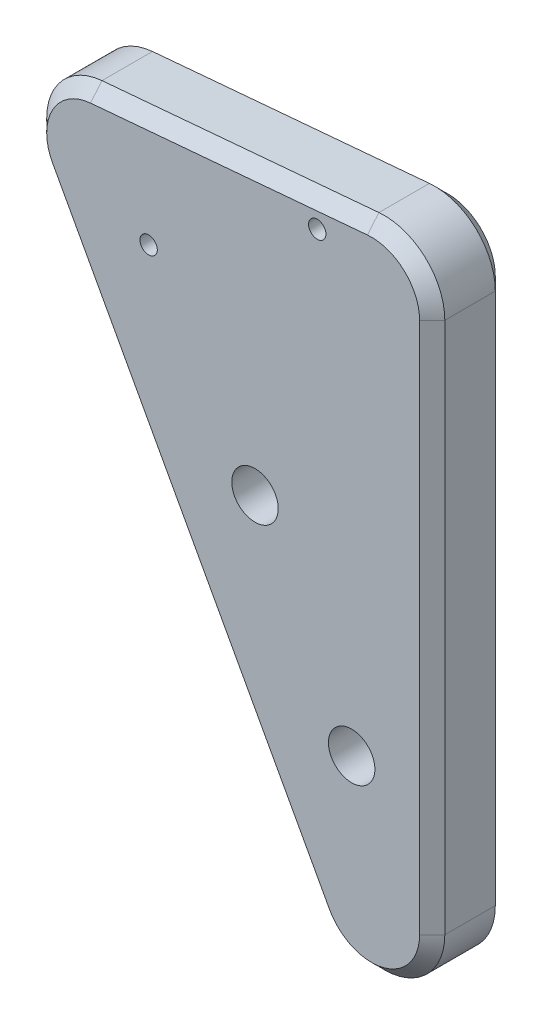
ISO-10303-21;
HEADER;
FILE_DESCRIPTION(('STEP AP214'),'2;1');
FILE_NAME('part.step','',(''),(''),'','','');
FILE_SCHEMA(('AUTOMOTIVE_DESIGN { 1 0 10303 214 1 1 1 1 }'));
ENDSEC;
DATA;
#1=APPLICATION_CONTEXT('core data for automotive mechanical design processes');
#2=APPLICATION_PROTOCOL_DEFINITION('international standard','automotive_design',2000,#1);
#3=PRODUCT_CONTEXT('',#1,'mechanical');
#4=PRODUCT('Part','Part','',(#3));
#5=PRODUCT_RELATED_PRODUCT_CATEGORY('part','',(#4));
#6=PRODUCT_DEFINITION_FORMATION('','',#4);
#7=PRODUCT_DEFINITION_CONTEXT('part definition',#1,'design');
#8=PRODUCT_DEFINITION('design','',#6,#7);
#9=PRODUCT_DEFINITION_SHAPE('','',#8);
#10=(LENGTH_UNIT() NAMED_UNIT(*) SI_UNIT(.MILLI.,.METRE.));
#11=(NAMED_UNIT(*) PLANE_ANGLE_UNIT() SI_UNIT($,.RADIAN.));
#12=(NAMED_UNIT(*) SI_UNIT($,.STERADIAN.) SOLID_ANGLE_UNIT());
#13=UNCERTAINTY_MEASURE_WITH_UNIT(LENGTH_MEASURE(1.E-05),#10,'distance_accuracy_value','');
#14=(GEOMETRIC_REPRESENTATION_CONTEXT(3) GLOBAL_UNCERTAINTY_ASSIGNED_CONTEXT((#13)) GLOBAL_UNIT_ASSIGNED_CONTEXT((#10,
#11,#12)) REPRESENTATION_CONTEXT('',''));
#15=CARTESIAN_POINT('',(0.,0.,0.));
#16=DIRECTION('',(0.,0.,1.));
#17=DIRECTION('',(1.,0.,0.));
#18=AXIS2_PLACEMENT_3D('',#15,#16,#17);
#19=CARTESIAN_POINT('',(0.,0.,9.525));
#20=DIRECTION('',(0.,0.,1.));
#21=DIRECTION('',(1.,0.,0.));
#22=AXIS2_PLACEMENT_3D('',#19,#20,#21);
#23=PLANE('',#22);
#24=DIRECTION('',(0.478691857940602,-0.877982975427984,0.));
#25=VECTOR('',#24,1.);
#26=CARTESIAN_POINT('',(41.7980470633415,-73.3467117631821,9.525));
#27=LINE('',#26,#25);
#28=CARTESIAN_POINT('',(6.96796387748848,-9.46382016464998,9.525));
#29=VERTEX_POINT('',#28);
#30=CARTESIAN_POINT('',(41.7980470633415,-73.3467117631821,9.525));
#31=VERTEX_POINT('',#30);
#32=EDGE_CURVE('E52',#29,#31,#27,.T.);
#33=ORIENTED_EDGE('',*,*,#32,.T.);
#34=CARTESIAN_POINT('',(47.0944793626107,-70.4590031301554,9.525));
#35=DIRECTION('',(0.,0.,1.));
#36=DIRECTION('',(1.,0.,0.));
#37=AXIS2_PLACEMENT_3D('',#34,#35,#36);
#38=CIRCLE('',#37,6.03249999999998);
#39=CARTESIAN_POINT('',(53.1269793626107,-70.4590031301554,9.525));
#40=VERTEX_POINT('',#39);
#41=EDGE_CURVE('E11',#31,#40,#38,.T.);
#42=ORIENTED_EDGE('',*,*,#41,.T.);
#43=DIRECTION('',(0.,1.,0.));
#44=VECTOR('',#43,1.);
#45=CARTESIAN_POINT('',(53.1269793626107,-3.52887410319627,9.525));
#46=LINE('',#45,#44);
#47=CARTESIAN_POINT('',(53.1269793626107,-3.52887410319627,9.525));
#48=VERTEX_POINT('',#47);
#49=EDGE_CURVE('E218',#40,#48,#46,.T.);
#50=ORIENTED_EDGE('',*,*,#49,.T.);
#51=CARTESIAN_POINT('',(47.0944793626107,-3.52887410319627,9.525));
#52=DIRECTION('',(0.,0.,1.));
#53=DIRECTION('',(1.,0.,0.));
#54=AXIS2_PLACEMENT_3D('',#51,#52,#53);
#55=CIRCLE('',#54,6.03249999999998);
#56=CARTESIAN_POINT('',(46.5687123444855,2.48067041304217,9.525));
#57=VERTEX_POINT('',#56);
#58=EDGE_CURVE('E215',#48,#57,#55,.T.);
#59=ORIENTED_EDGE('',*,*,#58,.T.);
#60=DIRECTION('',(-0.996194698091746,-0.0871557427476585,0.));
#61=VECTOR('',#60,1.);
#62=CARTESIAN_POINT('',(11.7386291586325,-0.566567015384878,9.525));
#63=LINE('',#62,#61);
#64=CARTESIAN_POINT('',(11.7386291586325,-0.566567015384878,9.525));
#65=VERTEX_POINT('',#64);
#66=EDGE_CURVE('E212',#57,#65,#63,.T.);
#67=ORIENTED_EDGE('',*,*,#66,.T.);
#68=CARTESIAN_POINT('',(12.2643961767578,-6.57611153162332,9.525));
#69=DIRECTION('',(0.,0.,1.));
#70=DIRECTION('',(1.,0.,0.));
#71=AXIS2_PLACEMENT_3D('',#68,#69,#70);
#72=CIRCLE('',#71,6.03249999999998);
#73=EDGE_CURVE('E63',#65,#29,#72,.T.);
#74=ORIENTED_EDGE('',*,*,#73,.T.);
#75=EDGE_LOOP('',(#33,#42,#50,#59,#67,#74));
#76=FACE_BOUND('',#75,.T.);
#77=CARTESIAN_POINT('',(40.2574839147834,-0.0475098776833559,9.525));
#78=DIRECTION('',(0.,0.,1.));
#79=DIRECTION('',(1.,0.,0.));
#80=AXIS2_PLACEMENT_3D('',#77,#78,#79);
#81=CIRCLE('',#80,1.0922);
#82=CARTESIAN_POINT('',(39.1652839147834,-0.0475098776833559,9.525));
#83=VERTEX_POINT('',#82);
#84=EDGE_CURVE('E304',#83,#83,#81,.T.);
#85=ORIENTED_EDGE('',*,*,#84,.F.);
#86=EDGE_LOOP('',(#85));
#87=FACE_BOUND('',#86,.T.);
#88=CARTESIAN_POINT('',(44.5870100650864,-55.247724237799,9.525));
#89=DIRECTION('',(0.,0.,1.));
#90=DIRECTION('',(1.,0.,0.));
#91=AXIS2_PLACEMENT_3D('',#88,#89,#90);
#92=CIRCLE('',#91,2.921);
#93=CARTESIAN_POINT('',(41.6660100650864,-55.247724237799,9.525));
#94=VERTEX_POINT('',#93);
#95=EDGE_CURVE('E291',#94,#94,#92,.T.);
#96=ORIENTED_EDGE('',*,*,#95,.F.);
#97=EDGE_LOOP('',(#96));
#98=FACE_BOUND('',#97,.T.);
#99=CARTESIAN_POINT('',(32.4282368733951,-32.9469566619282,9.525));
#100=DIRECTION('',(0.,0.,1.));
#101=DIRECTION('',(1.,0.,0.));
#102=AXIS2_PLACEMENT_3D('',#99,#100,#101);
#103=CIRCLE('',#102,2.921);
#104=CARTESIAN_POINT('',(29.5072368733951,-32.9469566619282,9.525));
#105=VERTEX_POINT('',#104);
#106=EDGE_CURVE('E296',#105,#105,#103,.T.);
#107=ORIENTED_EDGE('',*,*,#106,.F.);
#108=EDGE_LOOP('',(#107));
#109=FACE_BOUND('',#108,.T.);
#110=CARTESIAN_POINT('',(19.05,-12.3567040903117,9.525));
#111=DIRECTION('',(0.,0.,1.));
#112=DIRECTION('',(1.,0.,0.));
#113=AXIS2_PLACEMENT_3D('',#110,#111,#112);
#114=CIRCLE('',#113,1.0922);
#115=CARTESIAN_POINT('',(17.9578,-12.3567040903117,9.525));
#116=VERTEX_POINT('',#115);
#117=EDGE_CURVE('E312',#116,#116,#114,.T.);
#118=ORIENTED_EDGE('',*,*,#117,.F.);
#119=EDGE_LOOP('',(#118));
#120=FACE_BOUND('',#119,.T.);
#121=ADVANCED_FACE('F41',(#76,#87,#98,#109,#120),#23,.T.);
#122=CARTESIAN_POINT('',(0.,0.,0.));
#123=DIRECTION('',(0.,0.,1.));
#124=DIRECTION('',(1.,0.,0.));
#125=AXIS2_PLACEMENT_3D('',#122,#123,#124);
#126=PLANE('',#125);
#127=DIRECTION('',(-0.478691857940602,0.877982975427984,0.));
#128=VECTOR('',#127,1.);
#129=CARTESIAN_POINT('',(1.39379797349192,0.759923324480704,0.));
#130=LINE('',#129,#128);
#131=CARTESIAN_POINT('',(41.7980470633414,-73.3467117631821,0.));
#132=VERTEX_POINT('',#131);
#133=CARTESIAN_POINT('',(6.96796387748847,-9.46382016465,0.));
#134=VERTEX_POINT('',#133);
#135=EDGE_CURVE('E260',#132,#134,#130,.T.);
#136=ORIENTED_EDGE('',*,*,#135,.T.);
#137=CARTESIAN_POINT('',(12.2643961767578,-6.57611153162332,0.));
#138=DIRECTION('',(0.,0.,1.));
#139=DIRECTION('',(1.,0.,0.));
#140=AXIS2_PLACEMENT_3D('',#137,#138,#139);
#141=CIRCLE('',#140,6.0325);
#142=CARTESIAN_POINT('',(11.7386291586325,-0.566567015384858,0.));
#143=VERTEX_POINT('',#142);
#144=EDGE_CURVE('E139',#134,#143,#141,.F.);
#145=ORIENTED_EDGE('',*,*,#144,.T.);
#146=DIRECTION('',(0.996194698091746,0.0871557427476585,0.));
#147=VECTOR('',#146,1.);
#148=CARTESIAN_POINT('',(0.138359741611908,-1.58145908322065,0.));
#149=LINE('',#148,#147);
#150=CARTESIAN_POINT('',(46.5687123444855,2.48067041304219,0.));
#151=VERTEX_POINT('',#150);
#152=EDGE_CURVE('E132',#143,#151,#149,.T.);
#153=ORIENTED_EDGE('',*,*,#152,.T.);
#154=CARTESIAN_POINT('',(47.0944793626107,-3.52887410319627,0.));
#155=DIRECTION('',(0.,0.,1.));
#156=DIRECTION('',(1.,0.,0.));
#157=AXIS2_PLACEMENT_3D('',#154,#155,#156);
#158=CIRCLE('',#157,6.0325);
#159=CARTESIAN_POINT('',(53.1269793626107,-3.52887410319627,0.));
#160=VERTEX_POINT('',#159);
#161=EDGE_CURVE('E136',#151,#160,#158,.F.);
#162=ORIENTED_EDGE('',*,*,#161,.T.);
#163=DIRECTION('',(0.,-1.,0.));
#164=VECTOR('',#163,1.);
#165=CARTESIAN_POINT('',(53.1269793626107,0.,0.));
#166=LINE('',#165,#164);
#167=CARTESIAN_POINT('',(53.1269793626107,-70.4590031301554,0.));
#168=VERTEX_POINT('',#167);
#169=EDGE_CURVE('E144',#160,#168,#166,.T.);
#170=ORIENTED_EDGE('',*,*,#169,.T.);
#171=CARTESIAN_POINT('',(47.0944793626107,-70.4590031301554,0.));
#172=DIRECTION('',(0.,0.,1.));
#173=DIRECTION('',(1.,0.,0.));
#174=AXIS2_PLACEMENT_3D('',#171,#172,#173);
#175=CIRCLE('',#174,6.0325);
#176=EDGE_CURVE('E263',#168,#132,#175,.F.);
#177=ORIENTED_EDGE('',*,*,#176,.T.);
#178=EDGE_LOOP('',(#136,#145,#153,#162,#170,#177));
#179=FACE_BOUND('',#178,.T.);
#180=CARTESIAN_POINT('',(44.5870100650864,-55.247724237799,0.));
#181=DIRECTION('',(0.,0.,1.));
#182=DIRECTION('',(1.,0.,0.));
#183=AXIS2_PLACEMENT_3D('',#180,#181,#182);
#184=CIRCLE('',#183,2.921);
#185=CARTESIAN_POINT('',(41.6660100650864,-55.247724237799,0.));
#186=VERTEX_POINT('',#185);
#187=EDGE_CURVE('E292',#186,#186,#184,.T.);
#188=ORIENTED_EDGE('',*,*,#187,.T.);
#189=EDGE_LOOP('',(#188));
#190=FACE_BOUND('',#189,.T.);
#191=CARTESIAN_POINT('',(32.4282368733951,-32.9469566619282,0.));
#192=DIRECTION('',(0.,0.,1.));
#193=DIRECTION('',(1.,0.,0.));
#194=AXIS2_PLACEMENT_3D('',#191,#192,#193);
#195=CIRCLE('',#194,2.921);
#196=CARTESIAN_POINT('',(29.5072368733951,-32.9469566619282,0.));
#197=VERTEX_POINT('',#196);
#198=EDGE_CURVE('E300',#197,#197,#195,.T.);
#199=ORIENTED_EDGE('',*,*,#198,.T.);
#200=EDGE_LOOP('',(#199));
#201=FACE_BOUND('',#200,.T.);
#202=CARTESIAN_POINT('',(40.2574839147834,-0.0475098776833559,0.));
#203=DIRECTION('',(0.,0.,1.));
#204=DIRECTION('',(1.,0.,0.));
#205=AXIS2_PLACEMENT_3D('',#202,#203,#204);
#206=CIRCLE('',#205,1.0922);
#207=CARTESIAN_POINT('',(39.1652839147834,-0.0475098776833559,0.));
#208=VERTEX_POINT('',#207);
#209=EDGE_CURVE('E308',#208,#208,#206,.T.);
#210=ORIENTED_EDGE('',*,*,#209,.T.);
#211=EDGE_LOOP('',(#210));
#212=FACE_BOUND('',#211,.T.);
#213=CARTESIAN_POINT('',(19.05,-12.3567040903117,0.));
#214=DIRECTION('',(0.,0.,1.));
#215=DIRECTION('',(1.,0.,0.));
#216=AXIS2_PLACEMENT_3D('',#213,#214,#215);
#217=CIRCLE('',#216,1.0922);
#218=CARTESIAN_POINT('',(17.9578,-12.3567040903117,0.));
#219=VERTEX_POINT('',#218);
#220=EDGE_CURVE('E178',#219,#219,#217,.T.);
#221=ORIENTED_EDGE('',*,*,#220,.T.);
#222=EDGE_LOOP('',(#221));
#223=FACE_BOUND('',#222,.T.);
#224=ADVANCED_FACE('F134',(#179,#190,#201,#212,#223),#126,.F.);
#225=CARTESIAN_POINT('',(0.,0.,9.525));
#226=DIRECTION('',(0.0871557427476584,-0.996194698091745,0.));
#227=DIRECTION('',(0.996194698091746,0.0871557427476585,0.));
#228=AXIS2_PLACEMENT_3D('',#225,#226,#227);
#229=PLANE('',#228);
#230=DIRECTION('',(0.,0.,-1.));
#231=VECTOR('',#230,1.);
#232=CARTESIAN_POINT('',(46.4303526028736,4.06212949626283,9.525));
#233=LINE('',#232,#231);
#234=CARTESIAN_POINT('',(46.4303526028736,4.06212949626283,7.93749999999997));
#235=VERTEX_POINT('',#234);
#236=CARTESIAN_POINT('',(46.4303526028736,4.06212949626283,1.58749999999999));
#237=VERTEX_POINT('',#236);
#238=EDGE_CURVE('E271',#235,#237,#233,.T.);
#239=ORIENTED_EDGE('',*,*,#238,.T.);
#240=DIRECTION('',(-0.996194698091746,-0.0871557427476585,0.));
#241=VECTOR('',#240,1.);
#242=CARTESIAN_POINT('',(0.,0.,1.58749999999999));
#243=LINE('',#242,#241);
#244=CARTESIAN_POINT('',(11.6002694170206,1.01489206783579,1.58749999999999));
#245=VERTEX_POINT('',#244);
#246=EDGE_CURVE('E159',#237,#245,#243,.T.);
#247=ORIENTED_EDGE('',*,*,#246,.T.);
#248=DIRECTION('',(0.,0.,-1.));
#249=VECTOR('',#248,1.);
#250=CARTESIAN_POINT('',(11.6002694170206,1.01489206783579,9.525));
#251=LINE('',#250,#249);
#252=CARTESIAN_POINT('',(11.6002694170206,1.01489206783579,7.93749999999997));
#253=VERTEX_POINT('',#252);
#254=EDGE_CURVE('E156',#245,#253,#251,.F.);
#255=ORIENTED_EDGE('',*,*,#254,.T.);
#256=DIRECTION('',(0.996194698091746,0.0871557427476585,0.));
#257=VECTOR('',#256,1.);
#258=CARTESIAN_POINT('',(46.4303526028736,4.06212949626283,7.93749999999997));
#259=LINE('',#258,#257);
#260=EDGE_CURVE('E229',#253,#235,#259,.T.);
#261=ORIENTED_EDGE('',*,*,#260,.T.);
#262=EDGE_LOOP('',(#239,#247,#255,#261));
#263=FACE_BOUND('',#262,.T.);
#264=ADVANCED_FACE('F331',(#263),#229,.F.);
#265=CARTESIAN_POINT('',(0.,0.,9.525));
#266=DIRECTION('',(0.877982975427983,0.478691857940601,0.));
#267=DIRECTION('',(-0.478691857940602,0.877982975427984,0.));
#268=AXIS2_PLACEMENT_3D('',#265,#266,#267);
#269=PLANE('',#268);
#270=DIRECTION('',(0.,0.,-1.));
#271=VECTOR('',#270,1.);
#272=CARTESIAN_POINT('',(5.57416590399654,-10.2237434891307,9.525));
#273=LINE('',#272,#271);
#274=CARTESIAN_POINT('',(5.57416590399654,-10.2237434891307,7.93749999999997));
#275=VERTEX_POINT('',#274);
#276=CARTESIAN_POINT('',(5.57416590399654,-10.2237434891307,1.58749999999998));
#277=VERTEX_POINT('',#276);
#278=EDGE_CURVE('E279',#275,#277,#273,.T.);
#279=ORIENTED_EDGE('',*,*,#278,.T.);
#280=DIRECTION('',(0.478691857940602,-0.877982975427984,0.));
#281=VECTOR('',#280,1.);
#282=CARTESIAN_POINT('',(0.,0.,1.58749999999998));
#283=LINE('',#282,#281);
#284=CARTESIAN_POINT('',(40.4042490898495,-74.1066350876628,1.58749999999999));
#285=VERTEX_POINT('',#284);
#286=EDGE_CURVE('E245',#277,#285,#283,.T.);
#287=ORIENTED_EDGE('',*,*,#286,.T.);
#288=DIRECTION('',(0.,0.,-1.));
#289=VECTOR('',#288,1.);
#290=CARTESIAN_POINT('',(40.4042490898495,-74.1066350876628,9.525));
#291=LINE('',#290,#289);
#292=CARTESIAN_POINT('',(40.4042490898495,-74.1066350876628,7.93749999999997));
#293=VERTEX_POINT('',#292);
#294=EDGE_CURVE('E275',#285,#293,#291,.F.);
#295=ORIENTED_EDGE('',*,*,#294,.T.);
#296=DIRECTION('',(-0.478691857940602,0.877982975427984,0.));
#297=VECTOR('',#296,1.);
#298=CARTESIAN_POINT('',(5.57416590399655,-10.2237434891307,7.93749999999997));
#299=LINE('',#298,#297);
#300=EDGE_CURVE('E248',#293,#275,#299,.T.);
#301=ORIENTED_EDGE('',*,*,#300,.T.);
#302=EDGE_LOOP('',(#279,#287,#295,#301));
#303=FACE_BOUND('',#302,.T.);
#304=ADVANCED_FACE('F341',(#303),#269,.F.);
#305=CARTESIAN_POINT('',(54.7144793626107,-100.353454091419,9.525));
#306=DIRECTION('',(-1.,0.,0.));
#307=DIRECTION('',(0.,0.,1.));
#308=AXIS2_PLACEMENT_3D('',#305,#306,#307);
#309=PLANE('',#308);
#310=DIRECTION('',(0.,0.,-1.));
#311=VECTOR('',#310,1.);
#312=CARTESIAN_POINT('',(54.7144793626107,-70.4590031301554,9.525));
#313=LINE('',#312,#311);
#314=CARTESIAN_POINT('',(54.7144793626107,-70.4590031301554,7.93749999999997));
#315=VERTEX_POINT('',#314);
#316=CARTESIAN_POINT('',(54.7144793626107,-70.4590031301554,1.58749999999999));
#317=VERTEX_POINT('',#316);
#318=EDGE_CURVE('E283',#315,#317,#313,.T.);
#319=ORIENTED_EDGE('',*,*,#318,.T.);
#320=DIRECTION('',(0.,1.,0.));
#321=VECTOR('',#320,1.);
#322=CARTESIAN_POINT('',(54.7144793626107,-100.353454091419,1.58749999999999));
#323=LINE('',#322,#321);
#324=CARTESIAN_POINT('',(54.7144793626107,-3.52887410319627,1.58749999999999));
#325=VERTEX_POINT('',#324);
#326=EDGE_CURVE('E232',#317,#325,#323,.T.);
#327=ORIENTED_EDGE('',*,*,#326,.T.);
#328=DIRECTION('',(0.,0.,-1.));
#329=VECTOR('',#328,1.);
#330=CARTESIAN_POINT('',(54.7144793626107,-3.52887410319627,9.525));
#331=LINE('',#330,#329);
#332=CARTESIAN_POINT('',(54.7144793626107,-3.52887410319627,7.93749999999997));
#333=VERTEX_POINT('',#332);
#334=EDGE_CURVE('E287',#325,#333,#331,.F.);
#335=ORIENTED_EDGE('',*,*,#334,.T.);
#336=DIRECTION('',(0.,-1.,0.));
#337=VECTOR('',#336,1.);
#338=CARTESIAN_POINT('',(54.7144793626107,-70.4590031301554,7.93749999999997));
#339=LINE('',#338,#337);
#340=EDGE_CURVE('E235',#333,#315,#339,.T.);
#341=ORIENTED_EDGE('',*,*,#340,.T.);
#342=EDGE_LOOP('',(#319,#327,#335,#341));
#343=FACE_BOUND('',#342,.T.);
#344=ADVANCED_FACE('F338',(#343),#309,.F.);
#345=CARTESIAN_POINT('',(44.5870100650864,-55.247724237799,9.525));
#346=DIRECTION('',(0.,0.,-1.));
#347=DIRECTION('',(-1.,0.,0.));
#348=AXIS2_PLACEMENT_3D('',#345,#346,#347);
#349=CYLINDRICAL_SURFACE('',#348,2.921);
#350=CARTESIAN_POINT('',(41.6660100650864,-55.247724237799,9.525));
#351=CARTESIAN_POINT('',(41.6660100650864,-55.247724237799,9.42578125));
#352=CARTESIAN_POINT('',(41.6660100650864,-55.247724237799,9.3265625));
#353=CARTESIAN_POINT('',(41.6660100650864,-55.247724237799,9.128125));
#354=CARTESIAN_POINT('',(41.6660100650864,-55.247724237799,9.02890625));
#355=CARTESIAN_POINT('',(41.6660100650864,-55.247724237799,8.83046875));
#356=CARTESIAN_POINT('',(41.6660100650864,-55.247724237799,8.73125));
#357=CARTESIAN_POINT('',(41.6660100650864,-55.247724237799,8.5328125));
#358=CARTESIAN_POINT('',(41.6660100650864,-55.247724237799,8.43359375));
#359=CARTESIAN_POINT('',(41.6660100650864,-55.247724237799,8.23515625));
#360=CARTESIAN_POINT('',(41.6660100650864,-55.247724237799,8.1359375));
#361=CARTESIAN_POINT('',(41.6660100650864,-55.247724237799,7.9375));
#362=CARTESIAN_POINT('',(41.6660100650864,-55.247724237799,7.83828125));
#363=CARTESIAN_POINT('',(41.6660100650864,-55.247724237799,7.63984375));
#364=CARTESIAN_POINT('',(41.6660100650864,-55.247724237799,7.540625));
#365=CARTESIAN_POINT('',(41.6660100650864,-55.247724237799,7.3421875));
#366=CARTESIAN_POINT('',(41.6660100650864,-55.247724237799,7.24296875));
#367=CARTESIAN_POINT('',(41.6660100650864,-55.247724237799,7.04453125));
#368=CARTESIAN_POINT('',(41.6660100650864,-55.247724237799,6.9453125));
#369=CARTESIAN_POINT('',(41.6660100650864,-55.247724237799,6.746875));
#370=CARTESIAN_POINT('',(41.6660100650864,-55.247724237799,6.64765625));
#371=CARTESIAN_POINT('',(41.6660100650864,-55.247724237799,6.44921875));
#372=CARTESIAN_POINT('',(41.6660100650864,-55.247724237799,6.35));
#373=CARTESIAN_POINT('',(41.6660100650864,-55.247724237799,6.1515625));
#374=CARTESIAN_POINT('',(41.6660100650864,-55.247724237799,6.05234375));
#375=CARTESIAN_POINT('',(41.6660100650864,-55.247724237799,5.85390625));
#376=CARTESIAN_POINT('',(41.6660100650864,-55.247724237799,5.7546875));
#377=CARTESIAN_POINT('',(41.6660100650864,-55.247724237799,5.55625));
#378=CARTESIAN_POINT('',(41.6660100650864,-55.247724237799,5.45703125));
#379=CARTESIAN_POINT('',(41.6660100650864,-55.247724237799,5.25859375));
#380=CARTESIAN_POINT('',(41.6660100650864,-55.247724237799,5.159375));
#381=CARTESIAN_POINT('',(41.6660100650864,-55.247724237799,4.9609375));
#382=CARTESIAN_POINT('',(41.6660100650864,-55.247724237799,4.86171875));
#383=CARTESIAN_POINT('',(41.6660100650864,-55.247724237799,4.66328125));
#384=CARTESIAN_POINT('',(41.6660100650864,-55.247724237799,4.5640625));
#385=CARTESIAN_POINT('',(41.6660100650864,-55.247724237799,4.365625));
#386=CARTESIAN_POINT('',(41.6660100650864,-55.247724237799,4.26640625));
#387=CARTESIAN_POINT('',(41.6660100650864,-55.247724237799,4.06796875));
#388=CARTESIAN_POINT('',(41.6660100650864,-55.247724237799,3.96875));
#389=CARTESIAN_POINT('',(41.6660100650864,-55.247724237799,3.7703125));
#390=CARTESIAN_POINT('',(41.6660100650864,-55.247724237799,3.67109375));
#391=CARTESIAN_POINT('',(41.6660100650864,-55.247724237799,3.47265625));
#392=CARTESIAN_POINT('',(41.6660100650864,-55.247724237799,3.3734375));
#393=CARTESIAN_POINT('',(41.6660100650864,-55.247724237799,3.175));
#394=CARTESIAN_POINT('',(41.6660100650864,-55.247724237799,3.07578125));
#395=CARTESIAN_POINT('',(41.6660100650864,-55.247724237799,2.87734375));
#396=CARTESIAN_POINT('',(41.6660100650864,-55.247724237799,2.778125));
#397=CARTESIAN_POINT('',(41.6660100650864,-55.247724237799,2.5796875));
#398=CARTESIAN_POINT('',(41.6660100650864,-55.247724237799,2.48046875));
#399=CARTESIAN_POINT('',(41.6660100650864,-55.247724237799,2.28203125));
#400=CARTESIAN_POINT('',(41.6660100650864,-55.247724237799,2.1828125));
#401=CARTESIAN_POINT('',(41.6660100650864,-55.247724237799,1.984375));
#402=CARTESIAN_POINT('',(41.6660100650864,-55.247724237799,1.88515625));
#403=CARTESIAN_POINT('',(41.6660100650864,-55.247724237799,1.68671875));
#404=CARTESIAN_POINT('',(41.6660100650864,-55.247724237799,1.5875));
#405=CARTESIAN_POINT('',(41.6660100650864,-55.247724237799,1.3890625));
#406=CARTESIAN_POINT('',(41.6660100650864,-55.247724237799,1.28984375));
#407=CARTESIAN_POINT('',(41.6660100650864,-55.247724237799,1.09140625));
#408=CARTESIAN_POINT('',(41.6660100650864,-55.247724237799,0.992187500000001));
#409=CARTESIAN_POINT('',(41.6660100650864,-55.247724237799,0.793750000000001));
#410=CARTESIAN_POINT('',(41.6660100650864,-55.247724237799,0.69453125));
#411=CARTESIAN_POINT('',(41.6660100650864,-55.247724237799,0.49609375));
#412=CARTESIAN_POINT('',(41.6660100650864,-55.247724237799,0.396875));
#413=CARTESIAN_POINT('',(41.6660100650864,-55.247724237799,0.1984375));
#414=CARTESIAN_POINT('',(41.6660100650864,-55.247724237799,0.0992187500000001));
#415=CARTESIAN_POINT('',(41.6660100650864,-55.247724237799,0.));
#416=B_SPLINE_CURVE_WITH_KNOTS('',3,(#350,#351,#352,#353,#354,#355,#356,#357,#358,#359,#360,
#361,#362,#363,#364,#365,#366,#367,#368,#369,#370,#371,#372,#373,#374,#375,#376,#377,#378,#379,
#380,#381,#382,#383,#384,#385,#386,#387,#388,#389,#390,#391,#392,#393,#394,#395,#396,#397,#398,
#399,#400,#401,#402,#403,#404,#405,#406,#407,#408,#409,#410,#411,#412,#413,#414,#415),
.UNSPECIFIED.,.F.,.F.,(4,2,2,2,2,2,2,2,2,2,2,2,2,2,2,2,2,2,2,2,2,2,2,2,2,2,2,2,2,2,2,2,4),(0.,
0.297656249999998,0.595312499999999,0.892968749999999,1.190625,1.48828125,1.7859375,2.08359375,
2.38125,2.67890625,2.9765625,3.27421875,3.571875,3.86953125,4.1671875,4.46484375,4.7625,
5.06015625,5.3578125,5.65546875,5.953125,6.25078125,6.5484375,6.84609375,7.14375,7.44140625,
7.7390625,8.03671875,8.334375,8.63203125,8.9296875,9.22734375,9.525),.UNSPECIFIED.);
#417=EDGE_CURVE('BSEAM335',#94,#186,#416,.T.);
#418=ORIENTED_EDGE('',*,*,#95,.T.);
#419=ORIENTED_EDGE('',*,*,#187,.F.);
#420=ORIENTED_EDGE('',*,*,#417,.T.);
#421=ORIENTED_EDGE('',*,*,#417,.F.);
#422=EDGE_LOOP('',(#418,#420,#419,#421));
#423=FACE_BOUND('',#422,.T.);
#424=ADVANCED_FACE('F335',(#423),#349,.F.);
#425=CARTESIAN_POINT('',(32.4282368733951,-32.9469566619282,9.525));
#426=DIRECTION('',(0.,0.,-1.));
#427=DIRECTION('',(-1.,0.,0.));
#428=AXIS2_PLACEMENT_3D('',#425,#426,#427);
#429=CYLINDRICAL_SURFACE('',#428,2.921);
#430=CARTESIAN_POINT('',(29.5072368733951,-32.9469566619282,9.525));
#431=CARTESIAN_POINT('',(29.5072368733951,-32.9469566619282,9.42578125));
#432=CARTESIAN_POINT('',(29.5072368733951,-32.9469566619282,9.3265625));
#433=CARTESIAN_POINT('',(29.5072368733951,-32.9469566619282,9.128125));
#434=CARTESIAN_POINT('',(29.5072368733951,-32.9469566619282,9.02890625));
#435=CARTESIAN_POINT('',(29.5072368733951,-32.9469566619282,8.83046875));
#436=CARTESIAN_POINT('',(29.5072368733951,-32.9469566619282,8.73125));
#437=CARTESIAN_POINT('',(29.5072368733951,-32.9469566619282,8.5328125));
#438=CARTESIAN_POINT('',(29.5072368733951,-32.9469566619282,8.43359375));
#439=CARTESIAN_POINT('',(29.5072368733951,-32.9469566619282,8.23515625));
#440=CARTESIAN_POINT('',(29.5072368733951,-32.9469566619282,8.1359375));
#441=CARTESIAN_POINT('',(29.5072368733951,-32.9469566619282,7.9375));
#442=CARTESIAN_POINT('',(29.5072368733951,-32.9469566619282,7.83828125));
#443=CARTESIAN_POINT('',(29.5072368733951,-32.9469566619282,7.63984375));
#444=CARTESIAN_POINT('',(29.5072368733951,-32.9469566619282,7.540625));
#445=CARTESIAN_POINT('',(29.5072368733951,-32.9469566619282,7.3421875));
#446=CARTESIAN_POINT('',(29.5072368733951,-32.9469566619282,7.24296875));
#447=CARTESIAN_POINT('',(29.5072368733951,-32.9469566619282,7.04453125));
#448=CARTESIAN_POINT('',(29.5072368733951,-32.9469566619282,6.9453125));
#449=CARTESIAN_POINT('',(29.5072368733951,-32.9469566619282,6.746875));
#450=CARTESIAN_POINT('',(29.5072368733951,-32.9469566619282,6.64765625));
#451=CARTESIAN_POINT('',(29.5072368733951,-32.9469566619282,6.44921875));
#452=CARTESIAN_POINT('',(29.5072368733951,-32.9469566619282,6.35));
#453=CARTESIAN_POINT('',(29.5072368733951,-32.9469566619282,6.1515625));
#454=CARTESIAN_POINT('',(29.5072368733951,-32.9469566619282,6.05234375));
#455=CARTESIAN_POINT('',(29.5072368733951,-32.9469566619282,5.85390625));
#456=CARTESIAN_POINT('',(29.5072368733951,-32.9469566619282,5.7546875));
#457=CARTESIAN_POINT('',(29.5072368733951,-32.9469566619282,5.55625));
#458=CARTESIAN_POINT('',(29.5072368733951,-32.9469566619282,5.45703125));
#459=CARTESIAN_POINT('',(29.5072368733951,-32.9469566619282,5.25859375));
#460=CARTESIAN_POINT('',(29.5072368733951,-32.9469566619282,5.159375));
#461=CARTESIAN_POINT('',(29.5072368733951,-32.9469566619282,4.9609375));
#462=CARTESIAN_POINT('',(29.5072368733951,-32.9469566619282,4.86171875));
#463=CARTESIAN_POINT('',(29.5072368733951,-32.9469566619282,4.66328125));
#464=CARTESIAN_POINT('',(29.5072368733951,-32.9469566619282,4.5640625));
#465=CARTESIAN_POINT('',(29.5072368733951,-32.9469566619282,4.365625));
#466=CARTESIAN_POINT('',(29.5072368733951,-32.9469566619282,4.26640625));
#467=CARTESIAN_POINT('',(29.5072368733951,-32.9469566619282,4.06796875));
#468=CARTESIAN_POINT('',(29.5072368733951,-32.9469566619282,3.96875));
#469=CARTESIAN_POINT('',(29.5072368733951,-32.9469566619282,3.7703125));
#470=CARTESIAN_POINT('',(29.5072368733951,-32.9469566619282,3.67109375));
#471=CARTESIAN_POINT('',(29.5072368733951,-32.9469566619282,3.47265625));
#472=CARTESIAN_POINT('',(29.5072368733951,-32.9469566619282,3.3734375));
#473=CARTESIAN_POINT('',(29.5072368733951,-32.9469566619282,3.175));
#474=CARTESIAN_POINT('',(29.5072368733951,-32.9469566619282,3.07578125));
#475=CARTESIAN_POINT('',(29.5072368733951,-32.9469566619282,2.87734375));
#476=CARTESIAN_POINT('',(29.5072368733951,-32.9469566619282,2.778125));
#477=CARTESIAN_POINT('',(29.5072368733951,-32.9469566619282,2.5796875));
#478=CARTESIAN_POINT('',(29.5072368733951,-32.9469566619282,2.48046875));
#479=CARTESIAN_POINT('',(29.5072368733951,-32.9469566619282,2.28203125));
#480=CARTESIAN_POINT('',(29.5072368733951,-32.9469566619282,2.1828125));
#481=CARTESIAN_POINT('',(29.5072368733951,-32.9469566619282,1.984375));
#482=CARTESIAN_POINT('',(29.5072368733951,-32.9469566619282,1.88515625));
#483=CARTESIAN_POINT('',(29.5072368733951,-32.9469566619282,1.68671875));
#484=CARTESIAN_POINT('',(29.5072368733951,-32.9469566619282,1.5875));
#485=CARTESIAN_POINT('',(29.5072368733951,-32.9469566619282,1.3890625));
#486=CARTESIAN_POINT('',(29.5072368733951,-32.9469566619282,1.28984375));
#487=CARTESIAN_POINT('',(29.5072368733951,-32.9469566619282,1.09140625));
#488=CARTESIAN_POINT('',(29.5072368733951,-32.9469566619282,0.992187500000001));
#489=CARTESIAN_POINT('',(29.5072368733951,-32.9469566619282,0.793750000000001));
#490=CARTESIAN_POINT('',(29.5072368733951,-32.9469566619282,0.69453125));
#491=CARTESIAN_POINT('',(29.5072368733951,-32.9469566619282,0.49609375));
#492=CARTESIAN_POINT('',(29.5072368733951,-32.9469566619282,0.396875));
#493=CARTESIAN_POINT('',(29.5072368733951,-32.9469566619282,0.1984375));
#494=CARTESIAN_POINT('',(29.5072368733951,-32.9469566619282,0.0992187500000001));
#495=CARTESIAN_POINT('',(29.5072368733951,-32.9469566619282,0.));
#496=B_SPLINE_CURVE_WITH_KNOTS('',3,(#430,#431,#432,#433,#434,#435,#436,#437,#438,#439,#440,
#441,#442,#443,#444,#445,#446,#447,#448,#449,#450,#451,#452,#453,#454,#455,#456,#457,#458,#459,
#460,#461,#462,#463,#464,#465,#466,#467,#468,#469,#470,#471,#472,#473,#474,#475,#476,#477,#478,
#479,#480,#481,#482,#483,#484,#485,#486,#487,#488,#489,#490,#491,#492,#493,#494,#495),
.UNSPECIFIED.,.F.,.F.,(4,2,2,2,2,2,2,2,2,2,2,2,2,2,2,2,2,2,2,2,2,2,2,2,2,2,2,2,2,2,2,2,4),(0.,
0.297656249999998,0.595312499999999,0.892968749999999,1.190625,1.48828125,1.7859375,2.08359375,
2.38125,2.67890625,2.9765625,3.27421875,3.571875,3.86953125,4.1671875,4.46484375,4.7625,
5.06015625,5.3578125,5.65546875,5.953125,6.25078125,6.5484375,6.84609375,7.14375,7.44140625,
7.7390625,8.03671875,8.334375,8.63203125,8.9296875,9.22734375,9.525),.UNSPECIFIED.);
#497=EDGE_CURVE('BSEAM508',#105,#197,#496,.T.);
#498=ORIENTED_EDGE('',*,*,#106,.T.);
#499=ORIENTED_EDGE('',*,*,#198,.F.);
#500=ORIENTED_EDGE('',*,*,#497,.T.);
#501=ORIENTED_EDGE('',*,*,#497,.F.);
#502=EDGE_LOOP('',(#498,#500,#499,#501));
#503=FACE_BOUND('',#502,.T.);
#504=ADVANCED_FACE('F508',(#503),#429,.F.);
#505=CARTESIAN_POINT('',(40.2574839147834,-0.0475098776833559,9.525));
#506=DIRECTION('',(0.,0.,-1.));
#507=DIRECTION('',(-1.,0.,0.));
#508=AXIS2_PLACEMENT_3D('',#505,#506,#507);
#509=CYLINDRICAL_SURFACE('',#508,1.0922);
#510=CARTESIAN_POINT('',(39.1652839147834,-0.0475098776833559,9.525));
#511=CARTESIAN_POINT('',(39.1652839147834,-0.0475098776833559,9.42578125));
#512=CARTESIAN_POINT('',(39.1652839147834,-0.0475098776833559,9.3265625));
#513=CARTESIAN_POINT('',(39.1652839147834,-0.0475098776833559,9.128125));
#514=CARTESIAN_POINT('',(39.1652839147834,-0.0475098776833559,9.02890625));
#515=CARTESIAN_POINT('',(39.1652839147834,-0.0475098776833559,8.83046875));
#516=CARTESIAN_POINT('',(39.1652839147834,-0.0475098776833559,8.73125));
#517=CARTESIAN_POINT('',(39.1652839147834,-0.0475098776833559,8.5328125));
#518=CARTESIAN_POINT('',(39.1652839147834,-0.0475098776833559,8.43359375));
#519=CARTESIAN_POINT('',(39.1652839147834,-0.0475098776833559,8.23515625));
#520=CARTESIAN_POINT('',(39.1652839147834,-0.0475098776833559,8.1359375));
#521=CARTESIAN_POINT('',(39.1652839147834,-0.0475098776833559,7.9375));
#522=CARTESIAN_POINT('',(39.1652839147834,-0.0475098776833559,7.83828125));
#523=CARTESIAN_POINT('',(39.1652839147834,-0.0475098776833559,7.63984375));
#524=CARTESIAN_POINT('',(39.1652839147834,-0.0475098776833559,7.540625));
#525=CARTESIAN_POINT('',(39.1652839147834,-0.0475098776833559,7.3421875));
#526=CARTESIAN_POINT('',(39.1652839147834,-0.0475098776833559,7.24296875));
#527=CARTESIAN_POINT('',(39.1652839147834,-0.0475098776833559,7.04453125));
#528=CARTESIAN_POINT('',(39.1652839147834,-0.0475098776833559,6.9453125));
#529=CARTESIAN_POINT('',(39.1652839147834,-0.0475098776833559,6.746875));
#530=CARTESIAN_POINT('',(39.1652839147834,-0.0475098776833559,6.64765625));
#531=CARTESIAN_POINT('',(39.1652839147834,-0.0475098776833559,6.44921875));
#532=CARTESIAN_POINT('',(39.1652839147834,-0.0475098776833559,6.35));
#533=CARTESIAN_POINT('',(39.1652839147834,-0.0475098776833559,6.1515625));
#534=CARTESIAN_POINT('',(39.1652839147834,-0.0475098776833559,6.05234375));
#535=CARTESIAN_POINT('',(39.1652839147834,-0.0475098776833559,5.85390625));
#536=CARTESIAN_POINT('',(39.1652839147834,-0.0475098776833559,5.7546875));
#537=CARTESIAN_POINT('',(39.1652839147834,-0.0475098776833559,5.55625));
#538=CARTESIAN_POINT('',(39.1652839147834,-0.0475098776833559,5.45703125));
#539=CARTESIAN_POINT('',(39.1652839147834,-0.0475098776833559,5.25859375));
#540=CARTESIAN_POINT('',(39.1652839147834,-0.0475098776833559,5.159375));
#541=CARTESIAN_POINT('',(39.1652839147834,-0.0475098776833559,4.9609375));
#542=CARTESIAN_POINT('',(39.1652839147834,-0.0475098776833559,4.86171875));
#543=CARTESIAN_POINT('',(39.1652839147834,-0.0475098776833559,4.66328125));
#544=CARTESIAN_POINT('',(39.1652839147834,-0.0475098776833559,4.5640625));
#545=CARTESIAN_POINT('',(39.1652839147834,-0.0475098776833559,4.365625));
#546=CARTESIAN_POINT('',(39.1652839147834,-0.0475098776833559,4.26640625));
#547=CARTESIAN_POINT('',(39.1652839147834,-0.0475098776833559,4.06796875));
#548=CARTESIAN_POINT('',(39.1652839147834,-0.0475098776833559,3.96875));
#549=CARTESIAN_POINT('',(39.1652839147834,-0.0475098776833559,3.7703125));
#550=CARTESIAN_POINT('',(39.1652839147834,-0.0475098776833559,3.67109375));
#551=CARTESIAN_POINT('',(39.1652839147834,-0.0475098776833559,3.47265625));
#552=CARTESIAN_POINT('',(39.1652839147834,-0.0475098776833559,3.3734375));
#553=CARTESIAN_POINT('',(39.1652839147834,-0.0475098776833559,3.175));
#554=CARTESIAN_POINT('',(39.1652839147834,-0.0475098776833559,3.07578125));
#555=CARTESIAN_POINT('',(39.1652839147834,-0.0475098776833559,2.87734375));
#556=CARTESIAN_POINT('',(39.1652839147834,-0.0475098776833559,2.778125));
#557=CARTESIAN_POINT('',(39.1652839147834,-0.0475098776833559,2.5796875));
#558=CARTESIAN_POINT('',(39.1652839147834,-0.0475098776833559,2.48046875));
#559=CARTESIAN_POINT('',(39.1652839147834,-0.0475098776833559,2.28203125));
#560=CARTESIAN_POINT('',(39.1652839147834,-0.0475098776833559,2.1828125));
#561=CARTESIAN_POINT('',(39.1652839147834,-0.0475098776833559,1.984375));
#562=CARTESIAN_POINT('',(39.1652839147834,-0.0475098776833559,1.88515625));
#563=CARTESIAN_POINT('',(39.1652839147834,-0.0475098776833559,1.68671875));
#564=CARTESIAN_POINT('',(39.1652839147834,-0.0475098776833559,1.5875));
#565=CARTESIAN_POINT('',(39.1652839147834,-0.0475098776833559,1.3890625));
#566=CARTESIAN_POINT('',(39.1652839147834,-0.0475098776833559,1.28984375));
#567=CARTESIAN_POINT('',(39.1652839147834,-0.0475098776833559,1.09140625));
#568=CARTESIAN_POINT('',(39.1652839147834,-0.0475098776833559,0.992187500000001));
#569=CARTESIAN_POINT('',(39.1652839147834,-0.0475098776833559,0.793750000000001));
#570=CARTESIAN_POINT('',(39.1652839147834,-0.0475098776833559,0.69453125));
#571=CARTESIAN_POINT('',(39.1652839147834,-0.0475098776833559,0.49609375));
#572=CARTESIAN_POINT('',(39.1652839147834,-0.0475098776833559,0.396875));
#573=CARTESIAN_POINT('',(39.1652839147834,-0.0475098776833559,0.1984375));
#574=CARTESIAN_POINT('',(39.1652839147834,-0.0475098776833559,0.0992187500000001));
#575=CARTESIAN_POINT('',(39.1652839147834,-0.0475098776833559,0.));
#576=B_SPLINE_CURVE_WITH_KNOTS('',3,(#510,#511,#512,#513,#514,#515,#516,#517,#518,#519,#520,
#521,#522,#523,#524,#525,#526,#527,#528,#529,#530,#531,#532,#533,#534,#535,#536,#537,#538,#539,
#540,#541,#542,#543,#544,#545,#546,#547,#548,#549,#550,#551,#552,#553,#554,#555,#556,#557,#558,
#559,#560,#561,#562,#563,#564,#565,#566,#567,#568,#569,#570,#571,#572,#573,#574,#575),
.UNSPECIFIED.,.F.,.F.,(4,2,2,2,2,2,2,2,2,2,2,2,2,2,2,2,2,2,2,2,2,2,2,2,2,2,2,2,2,2,2,2,4),(0.,
0.29765625,0.5953125,0.892968750000001,1.190625,1.48828125,1.7859375,2.08359375,2.38125,
2.67890625,2.9765625,3.27421875,3.571875,3.86953125,4.1671875,4.46484375,4.7625,5.06015625,
5.3578125,5.65546875,5.953125,6.25078125,6.5484375,6.84609375,7.14375,7.44140625,7.7390625,
8.03671875,8.334375,8.63203125,8.9296875,9.22734375,9.525),.UNSPECIFIED.);
#577=EDGE_CURVE('BSEAM501',#83,#208,#576,.T.);
#578=ORIENTED_EDGE('',*,*,#84,.T.);
#579=ORIENTED_EDGE('',*,*,#209,.F.);
#580=ORIENTED_EDGE('',*,*,#577,.T.);
#581=ORIENTED_EDGE('',*,*,#577,.F.);
#582=EDGE_LOOP('',(#578,#580,#579,#581));
#583=FACE_BOUND('',#582,.T.);
#584=ADVANCED_FACE('F501',(#583),#509,.F.);
#585=CARTESIAN_POINT('',(19.05,-12.3567040903117,9.525));
#586=DIRECTION('',(0.,0.,-1.));
#587=DIRECTION('',(-1.,0.,0.));
#588=AXIS2_PLACEMENT_3D('',#585,#586,#587);
#589=CYLINDRICAL_SURFACE('',#588,1.0922);
#590=CARTESIAN_POINT('',(17.9578,-12.3567040903117,9.525));
#591=CARTESIAN_POINT('',(17.9578,-12.3567040903117,9.42578125));
#592=CARTESIAN_POINT('',(17.9578,-12.3567040903117,9.3265625));
#593=CARTESIAN_POINT('',(17.9578,-12.3567040903117,9.128125));
#594=CARTESIAN_POINT('',(17.9578,-12.3567040903117,9.02890625));
#595=CARTESIAN_POINT('',(17.9578,-12.3567040903117,8.83046875));
#596=CARTESIAN_POINT('',(17.9578,-12.3567040903117,8.73125));
#597=CARTESIAN_POINT('',(17.9578,-12.3567040903117,8.5328125));
#598=CARTESIAN_POINT('',(17.9578,-12.3567040903117,8.43359375));
#599=CARTESIAN_POINT('',(17.9578,-12.3567040903117,8.23515625));
#600=CARTESIAN_POINT('',(17.9578,-12.3567040903117,8.1359375));
#601=CARTESIAN_POINT('',(17.9578,-12.3567040903117,7.9375));
#602=CARTESIAN_POINT('',(17.9578,-12.3567040903117,7.83828125));
#603=CARTESIAN_POINT('',(17.9578,-12.3567040903117,7.63984375));
#604=CARTESIAN_POINT('',(17.9578,-12.3567040903117,7.540625));
#605=CARTESIAN_POINT('',(17.9578,-12.3567040903117,7.3421875));
#606=CARTESIAN_POINT('',(17.9578,-12.3567040903117,7.24296875));
#607=CARTESIAN_POINT('',(17.9578,-12.3567040903117,7.04453125));
#608=CARTESIAN_POINT('',(17.9578,-12.3567040903117,6.9453125));
#609=CARTESIAN_POINT('',(17.9578,-12.3567040903117,6.746875));
#610=CARTESIAN_POINT('',(17.9578,-12.3567040903117,6.64765625));
#611=CARTESIAN_POINT('',(17.9578,-12.3567040903117,6.44921875));
#612=CARTESIAN_POINT('',(17.9578,-12.3567040903117,6.35));
#613=CARTESIAN_POINT('',(17.9578,-12.3567040903117,6.1515625));
#614=CARTESIAN_POINT('',(17.9578,-12.3567040903117,6.05234375));
#615=CARTESIAN_POINT('',(17.9578,-12.3567040903117,5.85390625));
#616=CARTESIAN_POINT('',(17.9578,-12.3567040903117,5.7546875));
#617=CARTESIAN_POINT('',(17.9578,-12.3567040903117,5.55625));
#618=CARTESIAN_POINT('',(17.9578,-12.3567040903117,5.45703125));
#619=CARTESIAN_POINT('',(17.9578,-12.3567040903117,5.25859375));
#620=CARTESIAN_POINT('',(17.9578,-12.3567040903117,5.159375));
#621=CARTESIAN_POINT('',(17.9578,-12.3567040903117,4.9609375));
#622=CARTESIAN_POINT('',(17.9578,-12.3567040903117,4.86171875));
#623=CARTESIAN_POINT('',(17.9578,-12.3567040903117,4.66328125));
#624=CARTESIAN_POINT('',(17.9578,-12.3567040903117,4.5640625));
#625=CARTESIAN_POINT('',(17.9578,-12.3567040903117,4.365625));
#626=CARTESIAN_POINT('',(17.9578,-12.3567040903117,4.26640625));
#627=CARTESIAN_POINT('',(17.9578,-12.3567040903117,4.06796875));
#628=CARTESIAN_POINT('',(17.9578,-12.3567040903117,3.96875));
#629=CARTESIAN_POINT('',(17.9578,-12.3567040903117,3.7703125));
#630=CARTESIAN_POINT('',(17.9578,-12.3567040903117,3.67109375));
#631=CARTESIAN_POINT('',(17.9578,-12.3567040903117,3.47265625));
#632=CARTESIAN_POINT('',(17.9578,-12.3567040903117,3.3734375));
#633=CARTESIAN_POINT('',(17.9578,-12.3567040903117,3.175));
#634=CARTESIAN_POINT('',(17.9578,-12.3567040903117,3.07578125));
#635=CARTESIAN_POINT('',(17.9578,-12.3567040903117,2.87734375));
#636=CARTESIAN_POINT('',(17.9578,-12.3567040903117,2.778125));
#637=CARTESIAN_POINT('',(17.9578,-12.3567040903117,2.5796875));
#638=CARTESIAN_POINT('',(17.9578,-12.3567040903117,2.48046875));
#639=CARTESIAN_POINT('',(17.9578,-12.3567040903117,2.28203125));
#640=CARTESIAN_POINT('',(17.9578,-12.3567040903117,2.1828125));
#641=CARTESIAN_POINT('',(17.9578,-12.3567040903117,1.984375));
#642=CARTESIAN_POINT('',(17.9578,-12.3567040903117,1.88515625));
#643=CARTESIAN_POINT('',(17.9578,-12.3567040903117,1.68671875));
#644=CARTESIAN_POINT('',(17.9578,-12.3567040903117,1.5875));
#645=CARTESIAN_POINT('',(17.9578,-12.3567040903117,1.3890625));
#646=CARTESIAN_POINT('',(17.9578,-12.3567040903117,1.28984375));
#647=CARTESIAN_POINT('',(17.9578,-12.3567040903117,1.09140625));
#648=CARTESIAN_POINT('',(17.9578,-12.3567040903117,0.992187500000001));
#649=CARTESIAN_POINT('',(17.9578,-12.3567040903117,0.793750000000001));
#650=CARTESIAN_POINT('',(17.9578,-12.3567040903117,0.69453125));
#651=CARTESIAN_POINT('',(17.9578,-12.3567040903117,0.49609375));
#652=CARTESIAN_POINT('',(17.9578,-12.3567040903117,0.396875));
#653=CARTESIAN_POINT('',(17.9578,-12.3567040903117,0.1984375));
#654=CARTESIAN_POINT('',(17.9578,-12.3567040903117,0.0992187500000001));
#655=CARTESIAN_POINT('',(17.9578,-12.3567040903117,0.));
#656=B_SPLINE_CURVE_WITH_KNOTS('',3,(#590,#591,#592,#593,#594,#595,#596,#597,#598,#599,#600,
#601,#602,#603,#604,#605,#606,#607,#608,#609,#610,#611,#612,#613,#614,#615,#616,#617,#618,#619,
#620,#621,#622,#623,#624,#625,#626,#627,#628,#629,#630,#631,#632,#633,#634,#635,#636,#637,#638,
#639,#640,#641,#642,#643,#644,#645,#646,#647,#648,#649,#650,#651,#652,#653,#654,#655),
.UNSPECIFIED.,.F.,.F.,(4,2,2,2,2,2,2,2,2,2,2,2,2,2,2,2,2,2,2,2,2,2,2,2,2,2,2,2,2,2,2,2,4),(0.,
0.29765625,0.5953125,0.892968750000001,1.190625,1.48828125,1.7859375,2.08359375,2.38125,
2.67890625,2.9765625,3.27421875,3.571875,3.86953125,4.1671875,4.46484375,4.7625,5.06015625,
5.3578125,5.65546875,5.953125,6.25078125,6.5484375,6.84609375,7.14375,7.44140625,7.7390625,
8.03671875,8.334375,8.63203125,8.9296875,9.22734375,9.525),.UNSPECIFIED.);
#657=EDGE_CURVE('BSEAM323',#116,#219,#656,.T.);
#658=ORIENTED_EDGE('',*,*,#117,.T.);
#659=ORIENTED_EDGE('',*,*,#220,.F.);
#660=ORIENTED_EDGE('',*,*,#657,.T.);
#661=ORIENTED_EDGE('',*,*,#657,.F.);
#662=EDGE_LOOP('',(#658,#660,#659,#661));
#663=FACE_BOUND('',#662,.T.);
#664=ADVANCED_FACE('F323',(#663),#589,.F.);
#665=CARTESIAN_POINT('',(47.0944793626107,-70.4590031301554,9.525));
#666=DIRECTION('',(0.,0.,-1.));
#667=DIRECTION('',(-1.,0.,0.));
#668=AXIS2_PLACEMENT_3D('',#665,#666,#667);
#669=CYLINDRICAL_SURFACE('',#668,7.62);
#670=ORIENTED_EDGE('',*,*,#294,.F.);
#671=CARTESIAN_POINT('',(47.0944793626107,-70.4590031301554,1.58749999999999));
#672=DIRECTION('',(0.,0.,1.));
#673=DIRECTION('',(1.,0.,0.));
#674=AXIS2_PLACEMENT_3D('',#671,#672,#673);
#675=CIRCLE('',#674,7.62);
#676=EDGE_CURVE('E238',#285,#317,#675,.T.);
#677=ORIENTED_EDGE('',*,*,#676,.T.);
#678=ORIENTED_EDGE('',*,*,#318,.F.);
#679=CARTESIAN_POINT('',(47.0944793626107,-70.4590031301554,7.93749999999997));
#680=DIRECTION('',(0.,0.,1.));
#681=DIRECTION('',(1.,0.,0.));
#682=AXIS2_PLACEMENT_3D('',#679,#680,#681);
#683=CIRCLE('',#682,7.62);
#684=EDGE_CURVE('E241',#315,#293,#683,.F.);
#685=ORIENTED_EDGE('',*,*,#684,.T.);
#686=EDGE_LOOP('',(#670,#677,#678,#685));
#687=FACE_BOUND('',#686,.T.);
#688=ADVANCED_FACE('F349',(#687),#669,.T.);
#689=CARTESIAN_POINT('',(12.2643961767578,-6.57611153162332,9.525));
#690=DIRECTION('',(0.,0.,-1.));
#691=DIRECTION('',(-1.,0.,0.));
#692=AXIS2_PLACEMENT_3D('',#689,#690,#691);
#693=CYLINDRICAL_SURFACE('',#692,7.62);
#694=ORIENTED_EDGE('',*,*,#254,.F.);
#695=CARTESIAN_POINT('',(12.2643961767578,-6.57611153162332,1.58749999999999));
#696=DIRECTION('',(0.,0.,1.));
#697=DIRECTION('',(1.,0.,0.));
#698=AXIS2_PLACEMENT_3D('',#695,#696,#697);
#699=CIRCLE('',#698,7.62);
#700=EDGE_CURVE('E251',#245,#277,#699,.T.);
#701=ORIENTED_EDGE('',*,*,#700,.T.);
#702=ORIENTED_EDGE('',*,*,#278,.F.);
#703=CARTESIAN_POINT('',(12.2643961767578,-6.57611153162332,7.93749999999997));
#704=DIRECTION('',(0.,0.,1.));
#705=DIRECTION('',(1.,0.,0.));
#706=AXIS2_PLACEMENT_3D('',#703,#704,#705);
#707=CIRCLE('',#706,7.62);
#708=EDGE_CURVE('E255',#275,#253,#707,.F.);
#709=ORIENTED_EDGE('',*,*,#708,.T.);
#710=EDGE_LOOP('',(#694,#701,#702,#709));
#711=FACE_BOUND('',#710,.T.);
#712=ADVANCED_FACE('F352',(#711),#693,.T.);
#713=CARTESIAN_POINT('',(47.0944793626107,-3.52887410319627,9.525));
#714=DIRECTION('',(0.,0.,-1.));
#715=DIRECTION('',(-1.,0.,0.));
#716=AXIS2_PLACEMENT_3D('',#713,#714,#715);
#717=CYLINDRICAL_SURFACE('',#716,7.62);
#718=ORIENTED_EDGE('',*,*,#334,.F.);
#719=CARTESIAN_POINT('',(47.0944793626107,-3.52887410319627,1.58749999999999));
#720=DIRECTION('',(0.,0.,1.));
#721=DIRECTION('',(1.,0.,0.));
#722=AXIS2_PLACEMENT_3D('',#719,#720,#721);
#723=CIRCLE('',#722,7.62);
#724=EDGE_CURVE('E221',#325,#237,#723,.T.);
#725=ORIENTED_EDGE('',*,*,#724,.T.);
#726=ORIENTED_EDGE('',*,*,#238,.F.);
#727=CARTESIAN_POINT('',(47.0944793626107,-3.52887410319627,7.93749999999997));
#728=DIRECTION('',(0.,0.,1.));
#729=DIRECTION('',(1.,0.,0.));
#730=AXIS2_PLACEMENT_3D('',#727,#728,#729);
#731=CIRCLE('',#730,7.62);
#732=EDGE_CURVE('E224',#235,#333,#731,.F.);
#733=ORIENTED_EDGE('',*,*,#732,.T.);
#734=EDGE_LOOP('',(#718,#725,#726,#733));
#735=FACE_BOUND('',#734,.T.);
#736=ADVANCED_FACE('F356',(#735),#717,.T.);
#737=CARTESIAN_POINT('',(54.7144793626107,-100.353454091419,1.58749999999999));
#738=DIRECTION('',(-0.707106781186546,0.,0.707106781186549));
#739=DIRECTION('',(0.,1.,0.));
#740=AXIS2_PLACEMENT_3D('',#737,#738,#739);
#741=PLANE('',#740);
#742=DIRECTION('',(-0.707106781186549,0.,-0.707106781186546));
#743=VECTOR('',#742,1.);
#744=CARTESIAN_POINT('',(54.7144793626107,-3.52887410319627,1.58749999999999));
#745=LINE('',#744,#743);
#746=EDGE_CURVE('E154',#325,#160,#745,.T.);
#747=ORIENTED_EDGE('',*,*,#746,.F.);
#748=ORIENTED_EDGE('',*,*,#326,.F.);
#749=DIRECTION('',(0.707106781186549,0.,0.707106781186546));
#750=VECTOR('',#749,1.);
#751=CARTESIAN_POINT('',(53.1269793626107,-70.4590031301554,0.));
#752=LINE('',#751,#750);
#753=EDGE_CURVE('E174',#168,#317,#752,.T.);
#754=ORIENTED_EDGE('',*,*,#753,.F.);
#755=ORIENTED_EDGE('',*,*,#169,.F.);
#756=EDGE_LOOP('',(#747,#748,#754,#755));
#757=FACE_BOUND('',#756,.T.);
#758=ADVANCED_FACE('F360',(#757),#741,.F.);
#759=CARTESIAN_POINT('',(47.0944793626107,-70.4590031301554,0.));
#760=DIRECTION('',(0.,0.,1.));
#761=DIRECTION('',(1.,0.,0.));
#762=AXIS2_PLACEMENT_3D('',#759,#760,#761);
#763=CONICAL_SURFACE('',#762,6.0325,0.78539816339745);
#764=ORIENTED_EDGE('',*,*,#753,.T.);
#765=ORIENTED_EDGE('',*,*,#676,.F.);
#766=DIRECTION('',(-0.62082771569147,-0.338486258848587,0.707106781186547));
#767=VECTOR('',#766,1.);
#768=CARTESIAN_POINT('',(41.7980470633414,-73.3467117631821,0.));
#769=LINE('',#768,#767);
#770=EDGE_CURVE('E161',#132,#285,#769,.T.);
#771=ORIENTED_EDGE('',*,*,#770,.F.);
#772=ORIENTED_EDGE('',*,*,#176,.F.);
#773=EDGE_LOOP('',(#764,#765,#771,#772));
#774=FACE_BOUND('',#773,.T.);
#775=ADVANCED_FACE('F386',(#774),#763,.T.);
#776=CARTESIAN_POINT('',(47.0944793626107,-3.52887410319627,0.));
#777=DIRECTION('',(0.,0.,1.));
#778=DIRECTION('',(1.,0.,0.));
#779=AXIS2_PLACEMENT_3D('',#776,#777,#778);
#780=CONICAL_SURFACE('',#779,6.0325,0.785398163397449);
#781=ORIENTED_EDGE('',*,*,#746,.T.);
#782=ORIENTED_EDGE('',*,*,#161,.F.);
#783=DIRECTION('',(0.06162841671622,-0.704416026402759,-0.707106781186547));
#784=VECTOR('',#783,1.);
#785=CARTESIAN_POINT('',(46.4303526028736,4.06212949626283,1.58749999999999));
#786=LINE('',#785,#784);
#787=EDGE_CURVE('E151',#237,#151,#786,.T.);
#788=ORIENTED_EDGE('',*,*,#787,.F.);
#789=ORIENTED_EDGE('',*,*,#724,.F.);
#790=EDGE_LOOP('',(#781,#782,#788,#789));
#791=FACE_BOUND('',#790,.T.);
#792=ADVANCED_FACE('F149',(#791),#780,.T.);
#793=CARTESIAN_POINT('',(0.,0.,1.58749999999999));
#794=DIRECTION('',(0.620827715691468,0.338486258848586,0.707106781186549));
#795=DIRECTION('',(0.478691857940602,-0.877982975427984,0.));
#796=AXIS2_PLACEMENT_3D('',#793,#794,#795);
#797=PLANE('',#796);
#798=ORIENTED_EDGE('',*,*,#770,.T.);
#799=ORIENTED_EDGE('',*,*,#286,.F.);
#800=DIRECTION('',(-0.620827715691472,-0.338486258848587,0.707106781186544));
#801=VECTOR('',#800,1.);
#802=CARTESIAN_POINT('',(6.96796387748847,-9.46382016465,0.));
#803=LINE('',#802,#801);
#804=EDGE_CURVE('E162',#134,#277,#803,.T.);
#805=ORIENTED_EDGE('',*,*,#804,.F.);
#806=ORIENTED_EDGE('',*,*,#135,.F.);
#807=EDGE_LOOP('',(#798,#799,#805,#806));
#808=FACE_BOUND('',#807,.T.);
#809=ADVANCED_FACE('F374',(#808),#797,.F.);
#810=CARTESIAN_POINT('',(0.,0.,1.58749999999999));
#811=DIRECTION('',(0.0616284167162195,-0.704416026402758,0.707106781186549));
#812=DIRECTION('',(-0.996194698091746,-0.0871557427476585,0.));
#813=AXIS2_PLACEMENT_3D('',#810,#811,#812);
#814=PLANE('',#813);
#815=ORIENTED_EDGE('',*,*,#787,.T.);
#816=ORIENTED_EDGE('',*,*,#152,.F.);
#817=DIRECTION('',(0.0616284167162199,-0.70441602640276,-0.707106781186546));
#818=VECTOR('',#817,1.);
#819=CARTESIAN_POINT('',(11.6002694170206,1.01489206783579,1.58749999999999));
#820=LINE('',#819,#818);
#821=EDGE_CURVE('E168',#245,#143,#820,.T.);
#822=ORIENTED_EDGE('',*,*,#821,.F.);
#823=ORIENTED_EDGE('',*,*,#246,.F.);
#824=EDGE_LOOP('',(#815,#816,#822,#823));
#825=FACE_BOUND('',#824,.T.);
#826=ADVANCED_FACE('F158',(#825),#814,.F.);
#827=CARTESIAN_POINT('',(12.2643961767578,-6.57611153162332,0.));
#828=DIRECTION('',(0.,0.,1.));
#829=DIRECTION('',(1.,0.,0.));
#830=AXIS2_PLACEMENT_3D('',#827,#828,#829);
#831=CONICAL_SURFACE('',#830,6.0325,0.78539816339745);
#832=ORIENTED_EDGE('',*,*,#804,.T.);
#833=ORIENTED_EDGE('',*,*,#700,.F.);
#834=ORIENTED_EDGE('',*,*,#821,.T.);
#835=ORIENTED_EDGE('',*,*,#144,.F.);
#836=EDGE_LOOP('',(#832,#833,#834,#835));
#837=FACE_BOUND('',#836,.T.);
#838=ADVANCED_FACE('F363',(#837),#831,.T.);
#839=CARTESIAN_POINT('',(0.138359741611909,-1.58145908322066,9.525));
#840=DIRECTION('',(-0.0616284167162198,0.704416026402762,0.707106781186544));
#841=DIRECTION('',(0.996194698091746,0.0871557427476585,0.));
#842=AXIS2_PLACEMENT_3D('',#839,#840,#841);
#843=PLANE('',#842);
#844=DIRECTION('',(0.0616284167162188,-0.704416026402755,0.707106781186551));
#845=VECTOR('',#844,1.);
#846=CARTESIAN_POINT('',(46.4303526028736,4.06212949626283,7.93749999999997));
#847=LINE('',#846,#845);
#848=EDGE_CURVE('E192',#235,#57,#847,.T.);
#849=ORIENTED_EDGE('',*,*,#848,.F.);
#850=ORIENTED_EDGE('',*,*,#260,.F.);
#851=DIRECTION('',(-0.0616284167162196,0.704416026402755,-0.707106781186551));
#852=VECTOR('',#851,1.);
#853=CARTESIAN_POINT('',(11.7386291586325,-0.566567015384878,9.525));
#854=LINE('',#853,#852);
#855=EDGE_CURVE('E46',#65,#253,#854,.T.);
#856=ORIENTED_EDGE('',*,*,#855,.F.);
#857=ORIENTED_EDGE('',*,*,#66,.F.);
#858=EDGE_LOOP('',(#849,#850,#856,#857));
#859=FACE_BOUND('',#858,.T.);
#860=ADVANCED_FACE('F44',(#859),#843,.T.);
#861=CARTESIAN_POINT('',(12.2643961767578,-6.57611153162332,9.525));
#862=DIRECTION('',(0.,0.,-1.));
#863=DIRECTION('',(-1.,0.,0.));
#864=AXIS2_PLACEMENT_3D('',#861,#862,#863);
#865=CONICAL_SURFACE('',#864,6.03249999999998,0.785398163397444);
#866=ORIENTED_EDGE('',*,*,#855,.T.);
#867=ORIENTED_EDGE('',*,*,#708,.F.);
#868=DIRECTION('',(-0.620827715691466,-0.338486258848585,-0.707106781186551));
#869=VECTOR('',#868,1.);
#870=CARTESIAN_POINT('',(6.96796387748848,-9.46382016464998,9.525));
#871=LINE('',#870,#869);
#872=EDGE_CURVE('E189',#29,#275,#871,.T.);
#873=ORIENTED_EDGE('',*,*,#872,.F.);
#874=ORIENTED_EDGE('',*,*,#73,.F.);
#875=EDGE_LOOP('',(#866,#867,#873,#874));
#876=FACE_BOUND('',#875,.T.);
#877=ADVANCED_FACE('F425',(#876),#865,.T.);
#878=CARTESIAN_POINT('',(47.0944793626107,-3.52887410319627,9.525));
#879=DIRECTION('',(0.,0.,-1.));
#880=DIRECTION('',(-1.,0.,0.));
#881=AXIS2_PLACEMENT_3D('',#878,#879,#880);
#882=CONICAL_SURFACE('',#881,6.03249999999998,0.785398163397443);
#883=ORIENTED_EDGE('',*,*,#848,.T.);
#884=ORIENTED_EDGE('',*,*,#58,.F.);
#885=DIRECTION('',(-0.707106781186544,0.,0.707106781186551));
#886=VECTOR('',#885,1.);
#887=CARTESIAN_POINT('',(54.7144793626107,-3.52887410319627,7.93749999999997));
#888=LINE('',#887,#886);
#889=EDGE_CURVE('E185',#333,#48,#888,.T.);
#890=ORIENTED_EDGE('',*,*,#889,.F.);
#891=ORIENTED_EDGE('',*,*,#732,.F.);
#892=EDGE_LOOP('',(#883,#884,#890,#891));
#893=FACE_BOUND('',#892,.T.);
#894=ADVANCED_FACE('F419',(#893),#882,.T.);
#895=CARTESIAN_POINT('',(1.39379797349195,0.759923324480718,9.525));
#896=DIRECTION('',(-0.62082771569147,-0.338486258848587,0.707106781186546));
#897=DIRECTION('',(-0.478691857940602,0.877982975427984,0.));
#898=AXIS2_PLACEMENT_3D('',#895,#896,#897);
#899=PLANE('',#898);
#900=ORIENTED_EDGE('',*,*,#872,.T.);
#901=ORIENTED_EDGE('',*,*,#300,.F.);
#902=DIRECTION('',(-0.620827715691467,-0.338486258848586,-0.70710678118655));
#903=VECTOR('',#902,1.);
#904=CARTESIAN_POINT('',(41.7980470633415,-73.3467117631821,9.525));
#905=LINE('',#904,#903);
#906=EDGE_CURVE('E182',#31,#293,#905,.T.);
#907=ORIENTED_EDGE('',*,*,#906,.F.);
#908=ORIENTED_EDGE('',*,*,#32,.F.);
#909=EDGE_LOOP('',(#900,#901,#907,#908));
#910=FACE_BOUND('',#909,.T.);
#911=ADVANCED_FACE('F412',(#910),#899,.T.);
#912=CARTESIAN_POINT('',(53.1269793626107,0.,9.525));
#913=DIRECTION('',(0.707106781186551,0.,0.707106781186544));
#914=DIRECTION('',(0.,-1.,0.));
#915=AXIS2_PLACEMENT_3D('',#912,#913,#914);
#916=PLANE('',#915);
#917=ORIENTED_EDGE('',*,*,#889,.T.);
#918=ORIENTED_EDGE('',*,*,#49,.F.);
#919=DIRECTION('',(-0.707106781186544,0.,0.707106781186551));
#920=VECTOR('',#919,1.);
#921=CARTESIAN_POINT('',(54.7144793626107,-70.4590031301554,7.93749999999997));
#922=LINE('',#921,#920);
#923=EDGE_CURVE('E179',#315,#40,#922,.T.);
#924=ORIENTED_EDGE('',*,*,#923,.F.);
#925=ORIENTED_EDGE('',*,*,#340,.F.);
#926=EDGE_LOOP('',(#917,#918,#924,#925));
#927=FACE_BOUND('',#926,.T.);
#928=ADVANCED_FACE('F405',(#927),#916,.T.);
#929=CARTESIAN_POINT('',(47.0944793626107,-70.4590031301554,9.525));
#930=DIRECTION('',(0.,0.,-1.));
#931=DIRECTION('',(-1.,0.,0.));
#932=AXIS2_PLACEMENT_3D('',#929,#930,#931);
#933=CONICAL_SURFACE('',#932,6.03249999999998,0.785398163397445);
#934=ORIENTED_EDGE('',*,*,#906,.T.);
#935=ORIENTED_EDGE('',*,*,#684,.F.);
#936=ORIENTED_EDGE('',*,*,#923,.T.);
#937=ORIENTED_EDGE('',*,*,#41,.F.);
#938=EDGE_LOOP('',(#934,#935,#936,#937));
#939=FACE_BOUND('',#938,.T.);
#940=ADVANCED_FACE('F399',(#939),#933,.T.);
#941=CLOSED_SHELL('',(#121,#224,#264,#304,#344,#424,#504,#584,#664,#688,#712,#736,#758,#775,
#792,#809,#826,#838,#860,#877,#894,#911,#928,#940));
#942=MANIFOLD_SOLID_BREP('B2',#941);
#943=ADVANCED_BREP_SHAPE_REPRESENTATION('',(#18,#942),#14);
#944=SHAPE_DEFINITION_REPRESENTATION(#9,#943);
ENDSEC;
END-ISO-10303-21;
